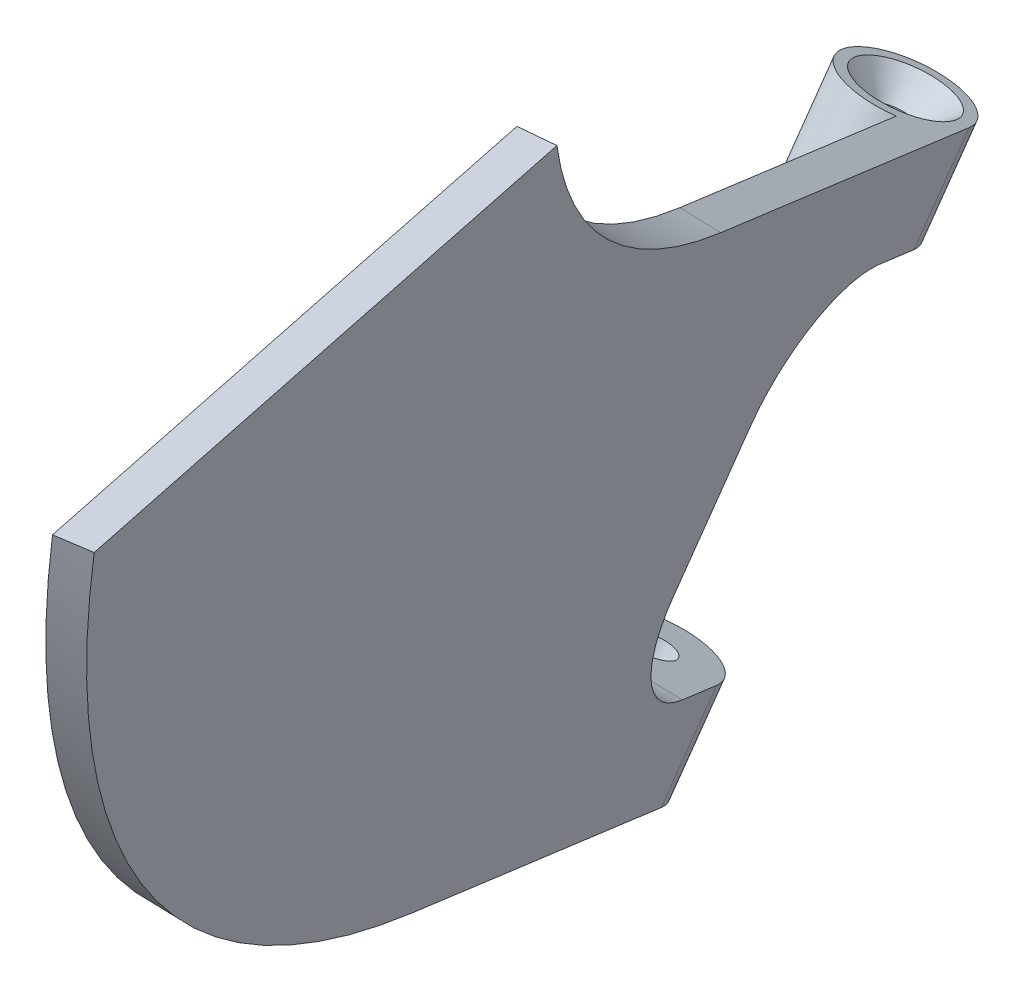
ISO-10303-21;
HEADER;
FILE_DESCRIPTION(('STEP AP214'),'2;1');
FILE_NAME('part.step','',(''),(''),'','','');
FILE_SCHEMA(('AUTOMOTIVE_DESIGN { 1 0 10303 214 1 1 1 1 }'));
ENDSEC;
DATA;
#1=APPLICATION_CONTEXT('core data for automotive mechanical design processes');
#2=APPLICATION_PROTOCOL_DEFINITION('international standard','automotive_design',2000,#1);
#3=PRODUCT_CONTEXT('',#1,'mechanical');
#4=PRODUCT('Part','Part','',(#3));
#5=PRODUCT_RELATED_PRODUCT_CATEGORY('part','',(#4));
#6=PRODUCT_DEFINITION_FORMATION('','',#4);
#7=PRODUCT_DEFINITION_CONTEXT('part definition',#1,'design');
#8=PRODUCT_DEFINITION('design','',#6,#7);
#9=PRODUCT_DEFINITION_SHAPE('','',#8);
#10=(LENGTH_UNIT() NAMED_UNIT(*) SI_UNIT(.MILLI.,.METRE.));
#11=(NAMED_UNIT(*) PLANE_ANGLE_UNIT() SI_UNIT($,.RADIAN.));
#12=(NAMED_UNIT(*) SI_UNIT($,.STERADIAN.) SOLID_ANGLE_UNIT());
#13=UNCERTAINTY_MEASURE_WITH_UNIT(LENGTH_MEASURE(1.E-05),#10,'distance_accuracy_value','');
#14=(GEOMETRIC_REPRESENTATION_CONTEXT(3) GLOBAL_UNCERTAINTY_ASSIGNED_CONTEXT((#13)) GLOBAL_UNIT_ASSIGNED_CONTEXT((#10,
#11,#12)) REPRESENTATION_CONTEXT('',''));
#15=CARTESIAN_POINT('',(0.,0.,0.));
#16=DIRECTION('',(0.,0.,1.));
#17=DIRECTION('',(1.,0.,0.));
#18=AXIS2_PLACEMENT_3D('',#15,#16,#17);
#19=CARTESIAN_POINT('',(143.876180409885,-16.6312894965581,4.66813646127313));
#20=DIRECTION('',(-0.139173100960059,-0.904654896047373,0.402778310025103));
#21=DIRECTION('',(0.,-0.406736643075801,-0.913545457642601));
#22=AXIS2_PLACEMENT_3D('',#19,#20,#21);
#23=CYLINDRICAL_SURFACE('',#22,2.50000000000002);
#24=DIRECTION('',(-0.139173100960059,-0.904654896047373,0.402778310025103));
#25=VECTOR('',#24,1.);
#26=CARTESIAN_POINT('',(146.255947317866,-17.2171083517496,4.17465319652709));
#27=LINE('',#26,#25);
#28=CARTESIAN_POINT('',(145.903995960637,-19.5048673819839,5.19322914186104));
#29=VERTEX_POINT('',#28);
#30=CARTESIAN_POINT('',(145.263799696218,-23.6662799038012,7.04600936797712));
#31=VERTEX_POINT('',#30);
#32=EDGE_CURVE('E265',#29,#31,#27,.T.);
#33=ORIENTED_EDGE('',*,*,#32,.T.);
#34=CARTESIAN_POINT('',(142.884032788241,-23.0804610486104,7.53949263272256));
#35=DIRECTION('',(0.139173100960059,0.904654896047373,-0.402778310025103));
#36=DIRECTION('',(0.,0.406736643075801,0.913545457642601));
#37=AXIS2_PLACEMENT_3D('',#34,#35,#36);
#38=CIRCLE('',#37,2.50000000000002);
#39=CARTESIAN_POINT('',(144.377383566394,-22.4611785878599,9.44642542839121));
#40=VERTEX_POINT('',#39);
#41=EDGE_CURVE('E257',#40,#31,#38,.F.);
#42=ORIENTED_EDGE('',*,*,#41,.F.);
#43=DIRECTION('',(-0.139173100960059,-0.904654896047373,0.402778310025103));
#44=VECTOR('',#43,1.);
#45=CARTESIAN_POINT('',(145.369531188038,-16.0120070358076,6.57506925694178));
#46=LINE('',#45,#44);
#47=CARTESIAN_POINT('',(145.01757983081,-18.299766066042,7.59364520227573));
#48=VERTEX_POINT('',#47);
#49=EDGE_CURVE('E284',#48,#40,#46,.T.);
#50=ORIENTED_EDGE('',*,*,#49,.F.);
#51=CARTESIAN_POINT('',(143.524229052657,-18.9190485267924,5.68671240660709));
#52=DIRECTION('',(0.139173100960058,0.904654896047373,-0.402778310025103));
#53=DIRECTION('',(0.,0.406736643075801,0.913545457642601));
#54=AXIS2_PLACEMENT_3D('',#51,#52,#53);
#55=CIRCLE('',#54,2.50000000000002);
#56=EDGE_CURVE('E268',#48,#29,#55,.F.);
#57=ORIENTED_EDGE('',*,*,#56,.T.);
#58=EDGE_LOOP('',(#33,#42,#50,#57));
#59=FACE_BOUND('',#58,.T.);
#60=ADVANCED_FACE('F148',(#59),#23,.T.);
#61=CARTESIAN_POINT('',(134.490475913316,-30.1983910002019,-29.0471408064601));
#62=DIRECTION('',(-0.951906763192123,0.23432754207654,0.197393305898306));
#63=DIRECTION('',(-0.239030618578201,-0.97101203050329,0.));
#64=AXIS2_PLACEMENT_3D('',#61,#62,#63);
#65=PLANE('',#64);
#66=DIRECTION('',(0.272954872017804,0.355935558889365,0.893759204573502));
#67=VECTOR('',#66,1.);
#68=CARTESIAN_POINT('',(145.787910415248,-20.6218391448085,14.0650326917169));
#69=LINE('',#68,#67);
#70=CARTESIAN_POINT('',(144.423136055159,-22.4015169392559,9.5962366688477));
#71=VERTEX_POINT('',#70);
#72=EDGE_CURVE('E387',#40,#71,#69,.T.);
#73=ORIENTED_EDGE('',*,*,#72,.T.);
#74=CARTESIAN_POINT('',(143.727270550358,-26.9247914194928,11.6101282189732));
#75=DIRECTION('',(-0.951906763192123,0.23432754207654,0.197393305898306));
#76=DIRECTION('',(-0.239030618578201,-0.97101203050329,0.));
#77=AXIS2_PLACEMENT_3D('',#74,#75,#76);
#78=CIRCLE('',#77,5.);
#79=CARTESIAN_POINT('',(145.092044910447,-25.145113625046,16.0789242418407));
#80=VERTEX_POINT('',#79);
#81=EDGE_CURVE('E308',#71,#80,#78,.F.);
#82=ORIENTED_EDGE('',*,*,#81,.T.);
#83=DIRECTION('',(-0.139173100960059,-0.904654896047373,0.402778310025103));
#84=VECTOR('',#83,1.);
#85=CARTESIAN_POINT('',(145.787910415248,-20.6218391448091,14.0650326917152));
#86=LINE('',#85,#84);
#87=CARTESIAN_POINT('',(144.201337064303,-30.9349049597492,18.6567054260014));
#88=VERTEX_POINT('',#87);
#89=EDGE_CURVE('E382',#80,#88,#86,.T.);
#90=ORIENTED_EDGE('',*,*,#89,.T.);
#91=CARTESIAN_POINT('',(142.836562704214,-32.714582754196,14.1879094031339));
#92=DIRECTION('',(-0.951906763192123,0.23432754207654,0.197393305898306));
#93=DIRECTION('',(-0.239030618578201,-0.97101203050329,0.));
#94=AXIS2_PLACEMENT_3D('',#91,#92,#93);
#95=CIRCLE('',#94,5.);
#96=CARTESIAN_POINT('',(142.140697199414,-37.2378572344329,16.2018009532594));
#97=VERTEX_POINT('',#96);
#98=EDGE_CURVE('E164',#88,#97,#95,.F.);
#99=ORIENTED_EDGE('',*,*,#98,.T.);
#100=DIRECTION('',(-0.272954872017804,-0.355935558889365,-0.893759204573502));
#101=VECTOR('',#100,1.);
#102=CARTESIAN_POINT('',(143.505471559503,-35.4581794399854,20.6705969761286));
#103=LINE('',#102,#101);
#104=CARTESIAN_POINT('',(142.094944710649,-37.2975188830368,16.0519897128029));
#105=VERTEX_POINT('',#104);
#106=EDGE_CURVE('E395',#97,#105,#103,.T.);
#107=ORIENTED_EDGE('',*,*,#106,.T.);
#108=CARTESIAN_POINT('',(141.454748446233,-41.4589314048547,17.9047699389184));
#109=VERTEX_POINT('',#108);
#110=EDGE_CURVE('E256',#105,#109,#46,.T.);
#111=ORIENTED_EDGE('',*,*,#110,.T.);
#112=DIRECTION('',(-0.272954872017804,-0.355935558889365,-0.893759204573502));
#113=VECTOR('',#112,1.);
#114=CARTESIAN_POINT('',(130.57569317151,-55.645315369249,-17.7174401244835));
#115=LINE('',#114,#113);
#116=CARTESIAN_POINT('',(145.741074704133,-35.8695241855986,31.9398502380258));
#117=VERTEX_POINT('',#116);
#118=EDGE_CURVE('E276',#117,#109,#115,.T.);
#119=ORIENTED_EDGE('',*,*,#118,.F.);
#120=CARTESIAN_POINT('',(152.991851090817,11.2620717414086,10.9555117469525));
#121=DIRECTION('',(-0.9519067631921,0.23432754207657,0.197393305898382));
#122=DIRECTION('',(-0.239030618578235,-0.971012030503282,0.));
#123=AXIS2_PLACEMENT_3D('',#120,#121,#122);
#124=CIRCLE('',#123,52.0989784424254);
#125=CARTESIAN_POINT('',(160.647492494551,0.,61.2432880900472));
#126=VERTEX_POINT('',#125);
#127=EDGE_CURVE('E427',#117,#126,#124,.T.);
#128=ORIENTED_EDGE('',*,*,#127,.T.);
#129=DIRECTION('',(-0.203046588965296,0.,-0.979169077692693));
#130=VECTOR('',#129,1.);
#131=CARTESIAN_POINT('',(141.617826281395,0.,-30.525112500592));
#132=LINE('',#131,#130);
#133=CARTESIAN_POINT('',(155.172931560098,-2.13370987545147E-13,34.8428407430963));
#134=VERTEX_POINT('',#133);
#135=EDGE_CURVE('E397',#126,#134,#132,.T.);
#136=ORIENTED_EDGE('',*,*,#135,.T.);
#137=CARTESIAN_POINT('',(152.991851090817,11.2620717414086,10.9555117469525));
#138=DIRECTION('',(-0.9519067631921,0.23432754207657,0.197393305898382));
#139=DIRECTION('',(-0.239030618578235,-0.971012030503282,0.));
#140=AXIS2_PLACEMENT_3D('',#137,#138,#139);
#141=CIRCLE('',#140,26.4989784424255);
#142=CARTESIAN_POINT('',(149.303906088711,-12.7103588467854,21.6287255013843));
#143=VERTEX_POINT('',#142);
#144=EDGE_CURVE('E412',#143,#134,#141,.T.);
#145=ORIENTED_EDGE('',*,*,#144,.F.);
#146=DIRECTION('',(0.272954872017804,0.355935558889365,0.893759204573502));
#147=VECTOR('',#146,1.);
#148=CARTESIAN_POINT('',(143.913083879505,-19.7400385213846,3.97710076914051));
#149=LINE('',#148,#147);
#150=EDGE_CURVE('E282',#48,#143,#149,.T.);
#151=ORIENTED_EDGE('',*,*,#150,.F.);
#152=ORIENTED_EDGE('',*,*,#49,.T.);
#153=EDGE_LOOP('',(#73,#82,#90,#99,#107,#111,#119,#128,#136,#145,#151,#152));
#154=FACE_BOUND('',#153,.T.);
#155=ADVANCED_FACE('F336',(#154),#65,.T.);
#156=CARTESIAN_POINT('',(154.514901911924,10.8871476740861,10.6396824575151));
#157=DIRECTION('',(-0.95190676319209,0.234327542076584,0.197393305898416));
#158=DIRECTION('',(-0.239030618578252,-0.971012030503278,0.));
#159=AXIS2_PLACEMENT_3D('',#156,#157,#158);
#160=CYLINDRICAL_SURFACE('',#159,26.4989784424255);
#161=CARTESIAN_POINT('',(198.741668475483,0.,1.46854511639221));
#162=DIRECTION('',(0.,1.,0.));
#163=DIRECTION('',(-0.979169077692669,0.,0.203046588965411));
#164=AXIS2_PLACEMENT_3D('',#161,#162,#163);
#165=ELLIPSE('',#164,113.085206321009,26.4989784424255);
#166=CARTESIAN_POINT('',(156.821757636685,0.,34.6884722540913));
#167=VERTEX_POINT('',#166);
#168=EDGE_CURVE('E400',#167,#134,#165,.F.);
#169=ORIENTED_EDGE('',*,*,#168,.F.);
#170=CARTESIAN_POINT('',(154.514901911924,10.8871476740861,10.6396824575151));
#171=DIRECTION('',(-0.9519067631921,0.23432754207657,0.197393305898382));
#172=DIRECTION('',(-0.239030618578235,-0.971012030503282,0.));
#173=AXIS2_PLACEMENT_3D('',#170,#171,#172);
#174=CIRCLE('',#173,26.4989784424255);
#175=CARTESIAN_POINT('',(150.826956909818,-13.0852829141079,21.3128962119468));
#176=VERTEX_POINT('',#175);
#177=EDGE_CURVE('E279',#176,#167,#174,.T.);
#178=ORIENTED_EDGE('',*,*,#177,.F.);
#179=DIRECTION('',(-0.95190676319209,0.234327542076584,0.197393305898416));
#180=VECTOR('',#179,1.);
#181=CARTESIAN_POINT('',(150.826956909818,-13.0852829141079,21.3128962119468));
#182=LINE('',#181,#180);
#183=EDGE_CURVE('E402',#176,#143,#182,.T.);
#184=ORIENTED_EDGE('',*,*,#183,.T.);
#185=ORIENTED_EDGE('',*,*,#144,.T.);
#186=EDGE_LOOP('',(#169,#178,#184,#185));
#187=FACE_BOUND('',#186,.T.);
#188=ADVANCED_FACE('F342',(#187),#160,.F.);
#189=CARTESIAN_POINT('',(154.514901911924,10.8871476740861,10.6396824575151));
#190=DIRECTION('',(-0.95190676319209,0.234327542076584,0.197393305898416));
#191=DIRECTION('',(-0.239030618578252,-0.971012030503278,0.));
#192=AXIS2_PLACEMENT_3D('',#189,#190,#191);
#193=CYLINDRICAL_SURFACE('',#192,52.0989784424254);
#194=CARTESIAN_POINT('',(154.514901911924,10.8871476740861,10.6396824575151));
#195=DIRECTION('',(-0.9519067631921,0.23432754207657,0.197393305898382));
#196=DIRECTION('',(-0.239030618578235,-0.971012030503282,0.));
#197=AXIS2_PLACEMENT_3D('',#194,#195,#196);
#198=CIRCLE('',#197,52.0989784424254);
#199=CARTESIAN_POINT('',(147.26412552524,-36.2444482529211,31.6240209485883));
#200=VERTEX_POINT('',#199);
#201=CARTESIAN_POINT('',(162.276579120215,0.,60.9937283444271));
#202=VERTEX_POINT('',#201);
#203=EDGE_CURVE('E418',#200,#202,#198,.T.);
#204=ORIENTED_EDGE('',*,*,#203,.T.);
#205=CARTESIAN_POINT('',(198.741668475483,0.,1.46854511639221));
#206=DIRECTION('',(0.,1.,0.));
#207=DIRECTION('',(-0.979169077692669,0.,0.203046588965411));
#208=AXIS2_PLACEMENT_3D('',#205,#206,#207);
#209=ELLIPSE('',#208,222.333994462324,52.0989784424254);
#210=EDGE_CURVE('E291',#202,#126,#209,.F.);
#211=ORIENTED_EDGE('',*,*,#210,.T.);
#212=ORIENTED_EDGE('',*,*,#127,.F.);
#213=DIRECTION('',(-0.95190676319209,0.234327542076584,0.197393305898416));
#214=VECTOR('',#213,1.);
#215=CARTESIAN_POINT('',(147.26412552524,-36.2444482529211,31.6240209485883));
#216=LINE('',#215,#214);
#217=EDGE_CURVE('E407',#200,#117,#216,.T.);
#218=ORIENTED_EDGE('',*,*,#217,.F.);
#219=EDGE_LOOP('',(#204,#211,#212,#218));
#220=FACE_BOUND('',#219,.T.);
#221=ADVANCED_FACE('F358',(#220),#193,.T.);
#222=CARTESIAN_POINT('',(142.437067839933,-43.4129078588149,13.8554904988706));
#223=DIRECTION('',(-0.139173100960059,-0.904654896047373,0.402778310025103));
#224=DIRECTION('',(0.,-0.406736643075801,-0.913545457642601));
#225=AXIS2_PLACEMENT_3D('',#222,#223,#224);
#226=PLANE('',#225);
#227=CARTESIAN_POINT('',(139.96139766808,-42.0782138656052,15.9978371432497));
#228=DIRECTION('',(-0.139173100960059,-0.904654896047373,0.402778310025103));
#229=DIRECTION('',(0.,-0.406736643075801,-0.913545457642601));
#230=AXIS2_PLACEMENT_3D('',#227,#228,#229);
#231=CIRCLE('',#230,2.00000000000002);
#232=CARTESIAN_POINT('',(139.96139766808,-42.8916871517568,14.1707462279645));
#233=VERTEX_POINT('',#232);
#234=EDGE_CURVE('E13',#233,#233,#231,.F.);
#235=ORIENTED_EDGE('',*,*,#234,.T.);
#236=EDGE_LOOP('',(#235));
#237=FACE_BOUND('',#236,.T.);
#238=ORIENTED_EDGE('',*,*,#118,.T.);
#239=CARTESIAN_POINT('',(139.96139766808,-42.0782138656052,15.9978371432497));
#240=DIRECTION('',(-0.139173100960059,-0.904654896047373,0.402778310025103));
#241=DIRECTION('',(0.,-0.406736643075801,-0.913545457642601));
#242=AXIS2_PLACEMENT_3D('',#239,#240,#241);
#243=CIRCLE('',#242,2.50000000000002);
#244=CARTESIAN_POINT('',(142.34116457606,-42.6640327207967,15.5043538785037));
#245=VERTEX_POINT('',#244);
#246=EDGE_CURVE('E269',#245,#109,#243,.F.);
#247=ORIENTED_EDGE('',*,*,#246,.F.);
#248=DIRECTION('',(0.272954872017976,0.355935558889323,0.893759204573467));
#249=VECTOR('',#248,1.);
#250=CARTESIAN_POINT('',(132.098743992604,-56.0202394365789,-18.0332694139423));
#251=LINE('',#250,#249);
#252=EDGE_CURVE('E264',#245,#200,#251,.T.);
#253=ORIENTED_EDGE('',*,*,#252,.T.);
#254=ORIENTED_EDGE('',*,*,#217,.T.);
#255=EDGE_LOOP('',(#238,#247,#253,#254));
#256=FACE_BOUND('',#255,.T.);
#257=ADVANCED_FACE('F352',(#237,#256),#226,.T.);
#258=CARTESIAN_POINT('',(145.999899224511,-20.2537425200022,3.54436576222795));
#259=DIRECTION('',(0.139173100960058,0.904654896047373,-0.402778310025103));
#260=DIRECTION('',(0.,0.406736643075801,0.913545457642601));
#261=AXIS2_PLACEMENT_3D('',#258,#259,#260);
#262=PLANE('',#261);
#263=CARTESIAN_POINT('',(143.524229052657,-18.9190485267925,5.68671240660708));
#264=DIRECTION('',(0.139173100960058,0.904654896047373,-0.402778310025103));
#265=DIRECTION('',(0.,0.406736643075801,0.913545457642601));
#266=AXIS2_PLACEMENT_3D('',#263,#264,#265);
#267=CIRCLE('',#266,2.00000000000005);
#268=CARTESIAN_POINT('',(143.524229052657,-18.1055752406408,7.51380332189233));
#269=VERTEX_POINT('',#268);
#270=EDGE_CURVE('E318',#269,#269,#267,.F.);
#271=ORIENTED_EDGE('',*,*,#270,.T.);
#272=EDGE_LOOP('',(#271));
#273=FACE_BOUND('',#272,.T.);
#274=ORIENTED_EDGE('',*,*,#150,.T.);
#275=ORIENTED_EDGE('',*,*,#183,.F.);
#276=DIRECTION('',(-0.272954872017976,-0.355935558889323,-0.893759204573467));
#277=VECTOR('',#276,1.);
#278=CARTESIAN_POINT('',(145.436134700612,-20.1149625887069,3.66127147970344));
#279=LINE('',#278,#277);
#280=EDGE_CURVE('E275',#176,#29,#279,.T.);
#281=ORIENTED_EDGE('',*,*,#280,.T.);
#282=ORIENTED_EDGE('',*,*,#56,.F.);
#283=EDGE_LOOP('',(#274,#275,#281,#282));
#284=FACE_BOUND('',#283,.T.);
#285=ADVANCED_FACE('F346',(#273,#284),#262,.T.);
#286=ORIENTED_EDGE('',*,*,#110,.F.);
#287=CARTESIAN_POINT('',(140.601593932496,-37.9168013437873,14.1450569171343));
#288=DIRECTION('',(-0.139173100960059,-0.904654896047373,0.402778310025103));
#289=DIRECTION('',(0.,-0.406736643075801,-0.913545457642601));
#290=AXIS2_PLACEMENT_3D('',#287,#288,#289);
#291=CIRCLE('',#290,2.50000000000002);
#292=CARTESIAN_POINT('',(142.981360840476,-38.5026201989787,13.6515736523882));
#293=VERTEX_POINT('',#292);
#294=EDGE_CURVE('E243',#293,#105,#291,.F.);
#295=ORIENTED_EDGE('',*,*,#294,.F.);
#296=EDGE_CURVE('E254',#293,#245,#27,.T.);
#297=ORIENTED_EDGE('',*,*,#296,.T.);
#298=ORIENTED_EDGE('',*,*,#246,.T.);
#299=EDGE_LOOP('',(#286,#295,#297,#298));
#300=FACE_BOUND('',#299,.T.);
#301=ADVANCED_FACE('F252',(#300),#23,.T.);
#302=CARTESIAN_POINT('',(136.013526734409,-30.5733150675319,-29.362970095919));
#303=DIRECTION('',(0.951906763192074,-0.234327542076604,-0.197393305898468));
#304=DIRECTION('',(0.239030618578274,0.971012030503272,0.));
#305=AXIS2_PLACEMENT_3D('',#302,#303,#304);
#306=PLANE('',#305);
#307=DIRECTION('',(0.272954872017886,0.355935558889345,0.893759204573485));
#308=VECTOR('',#307,1.);
#309=CARTESIAN_POINT('',(147.310961236352,-20.9967632121309,13.7492034022784));
#310=LINE('',#309,#308);
#311=CARTESIAN_POINT('',(145.946186876262,-22.7764410065776,9.28040737941102));
#312=VERTEX_POINT('',#311);
#313=EDGE_CURVE('E248',#31,#312,#310,.T.);
#314=ORIENTED_EDGE('',*,*,#313,.F.);
#315=ORIENTED_EDGE('',*,*,#32,.F.);
#316=ORIENTED_EDGE('',*,*,#280,.F.);
#317=ORIENTED_EDGE('',*,*,#177,.T.);
#318=DIRECTION('',(0.203046588965478,0.,0.979169077692655));
#319=VECTOR('',#318,1.);
#320=CARTESIAN_POINT('',(156.821757636685,0.,34.6884722540913));
#321=LINE('',#320,#319);
#322=EDGE_CURVE('E415',#167,#202,#321,.T.);
#323=ORIENTED_EDGE('',*,*,#322,.T.);
#324=ORIENTED_EDGE('',*,*,#203,.F.);
#325=ORIENTED_EDGE('',*,*,#252,.F.);
#326=ORIENTED_EDGE('',*,*,#296,.F.);
#327=DIRECTION('',(-0.272954872017886,-0.355935558889345,-0.893759204573485));
#328=VECTOR('',#327,1.);
#329=CARTESIAN_POINT('',(145.028522380607,-35.8331035073078,20.3547676866901));
#330=LINE('',#329,#328);
#331=CARTESIAN_POINT('',(143.663748020517,-37.6127813017545,15.8859716638227));
#332=VERTEX_POINT('',#331);
#333=EDGE_CURVE('E240',#332,#293,#330,.T.);
#334=ORIENTED_EDGE('',*,*,#333,.F.);
#335=CARTESIAN_POINT('',(144.359613525321,-33.0895068215185,13.8720801136964));
#336=DIRECTION('',(0.951906763192074,-0.234327542076604,-0.197393305898468));
#337=DIRECTION('',(0.239030618578274,0.971012030503272,0.));
#338=AXIS2_PLACEMENT_3D('',#335,#336,#337);
#339=CIRCLE('',#338,5.);
#340=CARTESIAN_POINT('',(145.724387885407,-31.3098290270709,18.3408761365646));
#341=VERTEX_POINT('',#340);
#342=EDGE_CURVE('E172',#332,#341,#339,.F.);
#343=ORIENTED_EDGE('',*,*,#342,.T.);
#344=DIRECTION('',(-0.139173100960059,-0.904654896047373,0.402778310025103));
#345=VECTOR('',#344,1.);
#346=CARTESIAN_POINT('',(147.310961236352,-20.9967632121309,13.7492034022784));
#347=LINE('',#346,#345);
#348=CARTESIAN_POINT('',(146.615095731552,-25.5200376923677,15.7630949524039));
#349=VERTEX_POINT('',#348);
#350=EDGE_CURVE('E249',#349,#341,#347,.T.);
#351=ORIENTED_EDGE('',*,*,#350,.F.);
#352=CARTESIAN_POINT('',(145.250321371466,-27.2997154868153,11.2942989295358));
#353=DIRECTION('',(0.951906763192074,-0.234327542076604,-0.197393305898468));
#354=DIRECTION('',(0.239030618578274,0.971012030503272,0.));
#355=AXIS2_PLACEMENT_3D('',#352,#353,#354);
#356=CIRCLE('',#355,5.);
#357=EDGE_CURVE('E306',#349,#312,#356,.F.);
#358=ORIENTED_EDGE('',*,*,#357,.T.);
#359=EDGE_LOOP('',(#314,#315,#316,#317,#323,#324,#325,#326,#334,#343,#351,#358));
#360=FACE_BOUND('',#359,.T.);
#361=ADVANCED_FACE('F262',(#360),#306,.T.);
#362=CARTESIAN_POINT('',(0.,0.,0.));
#363=DIRECTION('',(0.,1.,0.));
#364=DIRECTION('',(0.,0.,1.));
#365=AXIS2_PLACEMENT_3D('',#362,#363,#364);
#366=PLANE('',#365);
#367=ORIENTED_EDGE('',*,*,#322,.F.);
#368=ORIENTED_EDGE('',*,*,#168,.T.);
#369=ORIENTED_EDGE('',*,*,#135,.F.);
#370=ORIENTED_EDGE('',*,*,#210,.F.);
#371=EDGE_LOOP('',(#367,#368,#369,#370));
#372=FACE_BOUND('',#371,.T.);
#373=ADVANCED_FACE('F351',(#372),#366,.T.);
#374=CARTESIAN_POINT('',(124.799076917866,-15.4550917755572,18.4174077259105));
#375=DIRECTION('',(0.139173100960059,0.904654896047373,-0.402778310025103));
#376=DIRECTION('',(0.,0.406736643075801,0.913545457642601));
#377=AXIS2_PLACEMENT_3D('',#374,#375,#376);
#378=PLANE('',#377);
#379=CARTESIAN_POINT('',(142.884032788241,-23.0804610486104,7.53949263272256));
#380=DIRECTION('',(0.139173100960059,0.904654896047373,-0.402778310025103));
#381=DIRECTION('',(0.,0.406736643075801,0.913545457642601));
#382=AXIS2_PLACEMENT_3D('',#379,#380,#381);
#383=CIRCLE('',#382,0.90000000000002);
#384=CARTESIAN_POINT('',(142.884032788241,-22.7143980698421,8.36168354460091));
#385=VERTEX_POINT('',#384);
#386=EDGE_CURVE('E258',#385,#385,#383,.T.);
#387=ORIENTED_EDGE('',*,*,#386,.T.);
#388=EDGE_LOOP('',(#387));
#389=FACE_BOUND('',#388,.T.);
#390=ORIENTED_EDGE('',*,*,#313,.T.);
#391=DIRECTION('',(0.9519067631921,-0.23432754207657,-0.197393305898382));
#392=VECTOR('',#391,1.);
#393=CARTESIAN_POINT('',(144.423136055158,-22.4015169392558,9.59623666884778));
#394=LINE('',#393,#392);
#395=EDGE_CURVE('E303',#312,#71,#394,.F.);
#396=ORIENTED_EDGE('',*,*,#395,.T.);
#397=ORIENTED_EDGE('',*,*,#72,.F.);
#398=ORIENTED_EDGE('',*,*,#41,.T.);
#399=EDGE_LOOP('',(#390,#396,#397,#398));
#400=FACE_BOUND('',#399,.T.);
#401=ADVANCED_FACE('F453',(#389,#400),#378,.F.);
#402=CARTESIAN_POINT('',(122.516638062121,-30.2914320707342,25.0229720103222));
#403=DIRECTION('',(-0.139173100960059,-0.904654896047373,0.402778310025103));
#404=DIRECTION('',(0.,-0.406736643075801,-0.913545457642601));
#405=AXIS2_PLACEMENT_3D('',#402,#403,#404);
#406=PLANE('',#405);
#407=CARTESIAN_POINT('',(140.601593932496,-37.9168013437873,14.1450569171343));
#408=DIRECTION('',(-0.139173100960059,-0.904654896047373,0.402778310025103));
#409=DIRECTION('',(0.,-0.406736643075801,-0.913545457642601));
#410=AXIS2_PLACEMENT_3D('',#407,#408,#409);
#411=CIRCLE('',#410,0.90000000000002);
#412=CARTESIAN_POINT('',(140.601593932496,-38.2828643225555,13.3228660052559));
#413=VERTEX_POINT('',#412);
#414=EDGE_CURVE('E313',#413,#413,#411,.T.);
#415=ORIENTED_EDGE('',*,*,#414,.T.);
#416=EDGE_LOOP('',(#415));
#417=FACE_BOUND('',#416,.T.);
#418=ORIENTED_EDGE('',*,*,#106,.F.);
#419=DIRECTION('',(0.9519067631921,-0.23432754207657,-0.197393305898382));
#420=VECTOR('',#419,1.);
#421=CARTESIAN_POINT('',(143.663748020517,-37.6127813017545,15.8859716638227));
#422=LINE('',#421,#420);
#423=EDGE_CURVE('E245',#97,#332,#422,.T.);
#424=ORIENTED_EDGE('',*,*,#423,.T.);
#425=ORIENTED_EDGE('',*,*,#333,.T.);
#426=ORIENTED_EDGE('',*,*,#294,.T.);
#427=EDGE_LOOP('',(#418,#424,#425,#426));
#428=FACE_BOUND('',#427,.T.);
#429=ADVANCED_FACE('F242',(#417,#428),#406,.F.);
#430=CARTESIAN_POINT('',(124.799076917866,-15.4550917755572,18.4174077259105));
#431=DIRECTION('',(0.272954872017885,0.355935558889345,0.893759204573485));
#432=DIRECTION('',(0.,-0.929037703397889,0.369985061408128));
#433=AXIS2_PLACEMENT_3D('',#430,#431,#432);
#434=PLANE('',#433);
#435=ORIENTED_EDGE('',*,*,#89,.F.);
#436=DIRECTION('',(0.9519067631921,-0.23432754207657,-0.197393305898382));
#437=VECTOR('',#436,1.);
#438=CARTESIAN_POINT('',(146.615095731556,-25.5200376923687,15.7630949524031));
#439=LINE('',#438,#437);
#440=EDGE_CURVE('E300',#80,#349,#439,.T.);
#441=ORIENTED_EDGE('',*,*,#440,.T.);
#442=ORIENTED_EDGE('',*,*,#350,.T.);
#443=DIRECTION('',(0.9519067631921,-0.23432754207657,-0.197393305898382));
#444=VECTOR('',#443,1.);
#445=CARTESIAN_POINT('',(144.201337064303,-30.9349049597492,18.6567054260014));
#446=LINE('',#445,#444);
#447=EDGE_CURVE('E296',#341,#88,#446,.F.);
#448=ORIENTED_EDGE('',*,*,#447,.T.);
#449=EDGE_LOOP('',(#435,#441,#442,#448));
#450=FACE_BOUND('',#449,.T.);
#451=ADVANCED_FACE('F367',(#450),#434,.F.);
#452=CARTESIAN_POINT('',(122.738437052976,-21.7580440502408,15.9625032531686));
#453=DIRECTION('',(-0.9519067631921,0.23432754207657,0.197393305898382));
#454=DIRECTION('',(-0.239030618578235,-0.971012030503282,0.));
#455=AXIS2_PLACEMENT_3D('',#452,#453,#454);
#456=CYLINDRICAL_SURFACE('',#455,5.);
#457=ORIENTED_EDGE('',*,*,#81,.F.);
#458=ORIENTED_EDGE('',*,*,#395,.F.);
#459=ORIENTED_EDGE('',*,*,#357,.F.);
#460=ORIENTED_EDGE('',*,*,#440,.F.);
#461=EDGE_LOOP('',(#457,#458,#459,#460));
#462=FACE_BOUND('',#461,.T.);
#463=ADVANCED_FACE('F363',(#462),#456,.F.);
#464=CARTESIAN_POINT('',(121.847729206832,-27.547835384944,18.5402844373292));
#465=DIRECTION('',(-0.9519067631921,0.23432754207657,0.197393305898382));
#466=DIRECTION('',(-0.239030618578235,-0.971012030503282,0.));
#467=AXIS2_PLACEMENT_3D('',#464,#465,#466);
#468=CYLINDRICAL_SURFACE('',#467,5.);
#469=ORIENTED_EDGE('',*,*,#98,.F.);
#470=ORIENTED_EDGE('',*,*,#447,.F.);
#471=ORIENTED_EDGE('',*,*,#342,.F.);
#472=ORIENTED_EDGE('',*,*,#423,.F.);
#473=EDGE_LOOP('',(#469,#470,#471,#472));
#474=FACE_BOUND('',#473,.T.);
#475=ADVANCED_FACE('F366',(#474),#468,.F.);
#476=CARTESIAN_POINT('',(146.397707565405,-0.240824162227475,-2.62936887112607));
#477=DIRECTION('',(-0.139173100960059,-0.904654896047373,0.402778310025103));
#478=DIRECTION('',(0.,-0.406736643075801,-0.913545457642601));
#479=AXIS2_PLACEMENT_3D('',#476,#477,#478);
#480=CYLINDRICAL_SURFACE('',#479,0.90000000000002);
#481=CARTESIAN_POINT('',(140.114488079136,-41.0830934799531,15.5547810022221));
#482=DIRECTION('',(-0.139173100960064,-0.904654896047372,0.402778310025104));
#483=DIRECTION('',(0.,-0.406736643075802,-0.9135454576426));
#484=AXIS2_PLACEMENT_3D('',#481,#482,#483);
#485=CIRCLE('',#484,0.90000000000002);
#486=CARTESIAN_POINT('',(140.114488079136,-41.4491564587213,14.7325900903438));
#487=VERTEX_POINT('',#486);
#488=EDGE_CURVE('E157',#487,#487,#485,.T.);
#489=CARTESIAN_POINT('',(140.114488079136,-41.4491564587213,14.7325900903438));
#490=CARTESIAN_POINT('',(140.119562098441,-41.4161742489696,14.7179054644574));
#491=CARTESIAN_POINT('',(140.124636117747,-41.3831920392179,14.7032208385711));
#492=CARTESIAN_POINT('',(140.134784156359,-41.3172276197144,14.6738515867984));
#493=CARTESIAN_POINT('',(140.139858175665,-41.2842454099627,14.6591669609121));
#494=CARTESIAN_POINT('',(140.150006214276,-41.2182809904592,14.6297977091394));
#495=CARTESIAN_POINT('',(140.155080233582,-41.1852987807075,14.6151130832531));
#496=CARTESIAN_POINT('',(140.165228272194,-41.119334361204,14.5857438314804));
#497=CARTESIAN_POINT('',(140.1703022915,-41.0863521514523,14.5710592055941));
#498=CARTESIAN_POINT('',(140.180450330112,-41.0203877319489,14.5416899538214));
#499=CARTESIAN_POINT('',(140.185524349417,-40.9874055221971,14.5270053279351));
#500=CARTESIAN_POINT('',(140.195672388029,-40.9214411026937,14.4976360761624));
#501=CARTESIAN_POINT('',(140.200746407335,-40.888458892942,14.4829514502761));
#502=CARTESIAN_POINT('',(140.210894445947,-40.8224944734385,14.4535821985034));
#503=CARTESIAN_POINT('',(140.215968465252,-40.7895122636868,14.4388975726171));
#504=CARTESIAN_POINT('',(140.226116503864,-40.7235478441833,14.4095283208445));
#505=CARTESIAN_POINT('',(140.23119052317,-40.6905656344316,14.3948436949581));
#506=CARTESIAN_POINT('',(140.241338561782,-40.6246012149281,14.3654744431855));
#507=CARTESIAN_POINT('',(140.246412581087,-40.5916190051764,14.3507898172991));
#508=CARTESIAN_POINT('',(140.256560619699,-40.525654585673,14.3214205655265));
#509=CARTESIAN_POINT('',(140.261634639005,-40.4926723759212,14.3067359396401));
#510=CARTESIAN_POINT('',(140.271782677617,-40.4267079564178,14.2773666878675));
#511=CARTESIAN_POINT('',(140.276856696922,-40.3937257466661,14.2626820619811));
#512=CARTESIAN_POINT('',(140.287004735534,-40.3277613271626,14.2333128102085));
#513=CARTESIAN_POINT('',(140.29207875484,-40.2947791174109,14.2186281843221));
#514=CARTESIAN_POINT('',(140.302226793452,-40.2288146979074,14.1892589325495));
#515=CARTESIAN_POINT('',(140.307300812757,-40.1958324881557,14.1745743066631));
#516=CARTESIAN_POINT('',(140.317448851369,-40.1298680686522,14.1452050548905));
#517=CARTESIAN_POINT('',(140.322522870675,-40.0968858589005,14.1305204290041));
#518=CARTESIAN_POINT('',(140.332670909287,-40.0309214393971,14.1011511772315));
#519=CARTESIAN_POINT('',(140.337744928592,-39.9979392296453,14.0864665513452));
#520=CARTESIAN_POINT('',(140.347892967204,-39.9319748101419,14.0570972995725));
#521=CARTESIAN_POINT('',(140.35296698651,-39.8989926003902,14.0424126736862));
#522=CARTESIAN_POINT('',(140.363115025122,-39.8330281808867,14.0130434219135));
#523=CARTESIAN_POINT('',(140.368189044427,-39.800045971135,13.9983587960272));
#524=CARTESIAN_POINT('',(140.378337083039,-39.7340815516315,13.9689895442545));
#525=CARTESIAN_POINT('',(140.383411102345,-39.7010993418798,13.9543049183682));
#526=CARTESIAN_POINT('',(140.393559140957,-39.6351349223763,13.9249356665955));
#527=CARTESIAN_POINT('',(140.398633160262,-39.6021527126246,13.9102510407092));
#528=CARTESIAN_POINT('',(140.408781198874,-39.5361882931212,13.8808817889365));
#529=CARTESIAN_POINT('',(140.41385521818,-39.5032060833694,13.8661971630502));
#530=CARTESIAN_POINT('',(140.424003256792,-39.437241663866,13.8368279112775));
#531=CARTESIAN_POINT('',(140.429077276097,-39.4042594541143,13.8221432853912));
#532=CARTESIAN_POINT('',(140.439225314709,-39.3382950346108,13.7927740336185));
#533=CARTESIAN_POINT('',(140.444299334015,-39.3053128248591,13.7780894077322));
#534=CARTESIAN_POINT('',(140.454447372627,-39.2393484053556,13.7487201559595));
#535=CARTESIAN_POINT('',(140.459521391932,-39.2063661956039,13.7340355300732));
#536=CARTESIAN_POINT('',(140.469669430544,-39.1404017761004,13.7046662783005));
#537=CARTESIAN_POINT('',(140.47474344985,-39.1074195663487,13.6899816524142));
#538=CARTESIAN_POINT('',(140.484891488462,-39.0414551468453,13.6606124006415));
#539=CARTESIAN_POINT('',(140.489965507767,-39.0084729370935,13.6459277747552));
#540=CARTESIAN_POINT('',(140.500113546379,-38.9425085175901,13.6165585229825));
#541=CARTESIAN_POINT('',(140.505187565685,-38.9095263078383,13.6018738970962));
#542=CARTESIAN_POINT('',(140.515335604297,-38.8435618883349,13.5725046453235));
#543=CARTESIAN_POINT('',(140.520409623602,-38.8105796785832,13.5578200194372));
#544=CARTESIAN_POINT('',(140.530557662214,-38.7446152590797,13.5284507676646));
#545=CARTESIAN_POINT('',(140.53563168152,-38.711633049328,13.5137661417782));
#546=CARTESIAN_POINT('',(140.545779720132,-38.6456686298245,13.4843968900056));
#547=CARTESIAN_POINT('',(140.550853739437,-38.6126864200728,13.4697122641192));
#548=CARTESIAN_POINT('',(140.561001778049,-38.5467220005694,13.4403430123466));
#549=CARTESIAN_POINT('',(140.566075797355,-38.5137397908176,13.4256583864602));
#550=CARTESIAN_POINT('',(140.576223835967,-38.4477753713142,13.3962891346876));
#551=CARTESIAN_POINT('',(140.581297855273,-38.4147931615625,13.3816045088012));
#552=CARTESIAN_POINT('',(140.591445893884,-38.348828742059,13.3522352570286));
#553=CARTESIAN_POINT('',(140.59651991319,-38.3158465323073,13.3375506311422));
#554=CARTESIAN_POINT('',(140.601593932496,-38.2828643225555,13.3228660052559));
#555=B_SPLINE_CURVE_WITH_KNOTS('',3,(#489,#490,#491,#492,#493,#494,#495,#496,#497,#498,#499,
#500,#501,#502,#503,#504,#505,#506,#507,#508,#509,#510,#511,#512,#513,#514,#515,#516,#517,#518,
#519,#520,#521,#522,#523,#524,#525,#526,#527,#528,#529,#530,#531,#532,#533,#534,#535,#536,#537,
#538,#539,#540,#541,#542,#543,#544,#545,#546,#547,#548,#549,#550,#551,#552,#553,#554),
.UNSPECIFIED.,.F.,.F.,(4,2,2,2,2,2,2,2,2,2,2,2,2,2,2,2,2,2,2,2,2,2,2,2,2,2,2,2,2,2,2,2,4),(0.,
0.109375000000001,0.218749999999998,0.328125000000002,0.437499999999995,0.546874999999995,
0.656249999999992,0.765624999999991,0.874999999999988,0.984374999999988,1.09374999999999,
1.20312499999998,1.31249999999999,1.42187499999998,1.53124999999999,1.64062499999998,
1.74999999999998,1.85937499999998,1.96874999999998,2.07812499999998,2.18749999999998,
2.29687499999998,2.40624999999997,2.51562499999997,2.62499999999998,2.73437499999997,
2.84374999999997,2.95312499999997,3.06249999999997,3.17187499999996,3.28124999999996,
3.39062499999996,3.49999999999997),.UNSPECIFIED.);
#556=EDGE_CURVE('BSEAM323',#487,#413,#555,.T.);
#557=ORIENTED_EDGE('',*,*,#488,.T.);
#558=ORIENTED_EDGE('',*,*,#414,.F.);
#559=ORIENTED_EDGE('',*,*,#556,.T.);
#560=ORIENTED_EDGE('',*,*,#556,.F.);
#561=EDGE_LOOP('',(#557,#559,#558,#560));
#562=FACE_BOUND('',#561,.T.);
#563=ADVANCED_FACE('F323',(#562),#480,.F.);
#564=CARTESIAN_POINT('',(143.371138641601,-19.9141689124446,6.1297685476347));
#565=DIRECTION('',(0.139173100960039,0.904654896047376,-0.402778310025103));
#566=DIRECTION('',(0.,0.4067366430758,0.913545457642601));
#567=AXIS2_PLACEMENT_3D('',#564,#565,#566);
#568=CIRCLE('',#567,0.90000000000002);
#569=CARTESIAN_POINT('',(143.371138641601,-19.5481059336764,6.95195945951306));
#570=VERTEX_POINT('',#569);
#571=EDGE_CURVE('E312',#570,#570,#568,.T.);
#572=ORIENTED_EDGE('',*,*,#571,.T.);
#573=EDGE_LOOP('',(#572));
#574=FACE_BOUND('',#573,.T.);
#575=ORIENTED_EDGE('',*,*,#386,.F.);
#576=EDGE_LOOP('',(#575));
#577=FACE_BOUND('',#576,.T.);
#578=ADVANCED_FACE('F332',(#574,#577),#480,.F.);
#579=CARTESIAN_POINT('',(143.371138641601,-19.9141689124446,6.1297685476347));
#580=DIRECTION('',(0.139173100960039,0.904654896047376,-0.402778310025103));
#581=DIRECTION('',(0.,0.4067366430758,0.913545457642601));
#582=AXIS2_PLACEMENT_3D('',#579,#580,#581);
#583=CONICAL_SURFACE('',#582,0.90000000000002,0.785398163397454);
#584=ORIENTED_EDGE('',*,*,#270,.F.);
#585=EDGE_LOOP('',(#584));
#586=FACE_BOUND('',#585,.T.);
#587=ORIENTED_EDGE('',*,*,#571,.F.);
#588=EDGE_LOOP('',(#587));
#589=FACE_BOUND('',#588,.T.);
#590=ADVANCED_FACE('F327',(#586,#589),#583,.F.);
#591=CARTESIAN_POINT('',(140.114488079136,-41.0830934799531,15.5547810022221));
#592=DIRECTION('',(-0.139173100960064,-0.904654896047372,0.402778310025104));
#593=DIRECTION('',(0.,-0.406736643075802,-0.9135454576426));
#594=AXIS2_PLACEMENT_3D('',#591,#592,#593);
#595=CONICAL_SURFACE('',#594,0.90000000000002,0.785398163397444);
#596=ORIENTED_EDGE('',*,*,#234,.F.);
#597=EDGE_LOOP('',(#596));
#598=FACE_BOUND('',#597,.T.);
#599=ORIENTED_EDGE('',*,*,#488,.F.);
#600=EDGE_LOOP('',(#599));
#601=FACE_BOUND('',#600,.T.);
#602=ADVANCED_FACE('F151',(#598,#601),#595,.F.);
#603=CLOSED_SHELL('',(#60,#155,#188,#221,#257,#285,#301,#361,#373,#401,#429,#451,#463,#475,#563,
#578,#590,#602));
#604=MANIFOLD_SOLID_BREP('B2',#603);
#605=ADVANCED_BREP_SHAPE_REPRESENTATION('',(#18,#604),#14);
#606=SHAPE_DEFINITION_REPRESENTATION(#9,#605);
ENDSEC;
END-ISO-10303-21;
